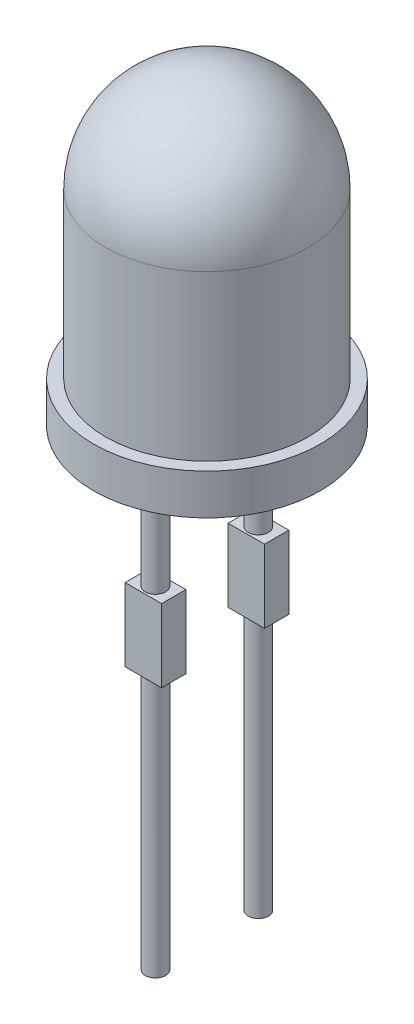
ISO-10303-21;
HEADER;
FILE_DESCRIPTION(('STEP AP214'),'2;1');
FILE_NAME('part.step','',(''),(''),'','','');
FILE_SCHEMA(('AUTOMOTIVE_DESIGN { 1 0 10303 214 1 1 1 1 }'));
ENDSEC;
DATA;
#1=APPLICATION_CONTEXT('core data for automotive mechanical design processes');
#2=APPLICATION_PROTOCOL_DEFINITION('international standard','automotive_design',2000,#1);
#3=PRODUCT_CONTEXT('',#1,'mechanical');
#4=PRODUCT('Part','Part','',(#3));
#5=PRODUCT_RELATED_PRODUCT_CATEGORY('part','',(#4));
#6=PRODUCT_DEFINITION_FORMATION('','',#4);
#7=PRODUCT_DEFINITION_CONTEXT('part definition',#1,'design');
#8=PRODUCT_DEFINITION('design','',#6,#7);
#9=PRODUCT_DEFINITION_SHAPE('','',#8);
#10=(LENGTH_UNIT() NAMED_UNIT(*) SI_UNIT(.MILLI.,.METRE.));
#11=(NAMED_UNIT(*) PLANE_ANGLE_UNIT() SI_UNIT($,.RADIAN.));
#12=(NAMED_UNIT(*) SI_UNIT($,.STERADIAN.) SOLID_ANGLE_UNIT());
#13=UNCERTAINTY_MEASURE_WITH_UNIT(LENGTH_MEASURE(1.E-05),#10,'distance_accuracy_value','');
#14=(GEOMETRIC_REPRESENTATION_CONTEXT(3) GLOBAL_UNCERTAINTY_ASSIGNED_CONTEXT((#13)) GLOBAL_UNIT_ASSIGNED_CONTEXT((#10,
#11,#12)) REPRESENTATION_CONTEXT('',''));
#15=CARTESIAN_POINT('',(0.,0.,0.));
#16=DIRECTION('',(0.,0.,1.));
#17=DIRECTION('',(1.,0.,0.));
#18=AXIS2_PLACEMENT_3D('',#15,#16,#17);
#19=CARTESIAN_POINT('',(0.,-14.025,-1.27));
#20=DIRECTION('',(0.,1.,0.));
#21=DIRECTION('',(0.,0.,1.));
#22=AXIS2_PLACEMENT_3D('',#19,#20,#21);
#23=CYLINDRICAL_SURFACE('',#22,0.25);
#24=CARTESIAN_POINT('',(0.,-3.025,-1.27));
#25=DIRECTION('',(0.,-1.,0.));
#26=DIRECTION('',(0.,0.,1.));
#27=AXIS2_PLACEMENT_3D('',#24,#25,#26);
#28=CIRCLE('',#27,0.25);
#29=CARTESIAN_POINT('',(0.,-3.025,-1.02));
#30=VERTEX_POINT('',#29);
#31=EDGE_CURVE('E128',#30,#30,#28,.T.);
#32=ORIENTED_EDGE('',*,*,#31,.T.);
#33=EDGE_LOOP('',(#32));
#34=FACE_BOUND('',#33,.T.);
#35=CARTESIAN_POINT('',(0.,-5.825,-1.27));
#36=DIRECTION('',(0.,-1.,0.));
#37=DIRECTION('',(0.,0.,-1.));
#38=AXIS2_PLACEMENT_3D('',#35,#36,#37);
#39=CIRCLE('',#38,0.25);
#40=CARTESIAN_POINT('',(0.,-5.825,-1.52));
#41=VERTEX_POINT('',#40);
#42=EDGE_CURVE('E12',#41,#41,#39,.T.);
#43=ORIENTED_EDGE('',*,*,#42,.F.);
#44=EDGE_LOOP('',(#43));
#45=FACE_BOUND('',#44,.T.);
#46=ADVANCED_FACE('F50',(#34,#45),#23,.T.);
#47=CARTESIAN_POINT('',(0.,-3.025,-1.27));
#48=DIRECTION('',(0.,1.,0.));
#49=DIRECTION('',(0.,0.,1.));
#50=AXIS2_PLACEMENT_3D('',#47,#48,#49);
#51=PLANE('',#50);
#52=ORIENTED_EDGE('',*,*,#31,.F.);
#53=EDGE_LOOP('',(#52));
#54=FACE_BOUND('',#53,.T.);
#55=ADVANCED_FACE('F149',(#54),#51,.T.);
#56=CARTESIAN_POINT('',(0.45,-5.825,-1.57));
#57=DIRECTION('',(0.,0.,1.));
#58=DIRECTION('',(0.,-1.,0.));
#59=AXIS2_PLACEMENT_3D('',#56,#57,#58);
#60=PLANE('',#59);
#61=DIRECTION('',(0.,1.,0.));
#62=VECTOR('',#61,1.);
#63=CARTESIAN_POINT('',(-0.45,-5.825,-1.57));
#64=LINE('',#63,#62);
#65=CARTESIAN_POINT('',(-0.45,-7.625,-1.57));
#66=VERTEX_POINT('',#65);
#67=CARTESIAN_POINT('',(-0.45,-5.825,-1.57));
#68=VERTEX_POINT('',#67);
#69=EDGE_CURVE('E118',#66,#68,#64,.T.);
#70=ORIENTED_EDGE('',*,*,#69,.T.);
#71=DIRECTION('',(-1.,0.,0.));
#72=VECTOR('',#71,1.);
#73=CARTESIAN_POINT('',(0.45,-5.825,-1.57));
#74=LINE('',#73,#72);
#75=CARTESIAN_POINT('',(0.45,-5.825,-1.57));
#76=VERTEX_POINT('',#75);
#77=EDGE_CURVE('E109',#76,#68,#74,.T.);
#78=ORIENTED_EDGE('',*,*,#77,.F.);
#79=DIRECTION('',(0.,1.,0.));
#80=VECTOR('',#79,1.);
#81=CARTESIAN_POINT('',(0.45,-5.825,-1.57));
#82=LINE('',#81,#80);
#83=CARTESIAN_POINT('',(0.45,-7.625,-1.57));
#84=VERTEX_POINT('',#83);
#85=EDGE_CURVE('E103',#84,#76,#82,.T.);
#86=ORIENTED_EDGE('',*,*,#85,.F.);
#87=DIRECTION('',(-1.,0.,0.));
#88=VECTOR('',#87,1.);
#89=CARTESIAN_POINT('',(0.45,-7.625,-1.57));
#90=LINE('',#89,#88);
#91=EDGE_CURVE('E114',#84,#66,#90,.T.);
#92=ORIENTED_EDGE('',*,*,#91,.T.);
#93=EDGE_LOOP('',(#70,#78,#86,#92));
#94=FACE_BOUND('',#93,.T.);
#95=ADVANCED_FACE('F154',(#94),#60,.F.);
#96=CARTESIAN_POINT('',(0.45,-5.825,-0.970000000000001));
#97=DIRECTION('',(0.,-1.,0.));
#98=DIRECTION('',(0.,0.,-1.));
#99=AXIS2_PLACEMENT_3D('',#96,#97,#98);
#100=PLANE('',#99);
#101=ORIENTED_EDGE('',*,*,#42,.T.);
#102=EDGE_LOOP('',(#101));
#103=FACE_BOUND('',#102,.T.);
#104=DIRECTION('',(0.,0.,1.));
#105=VECTOR('',#104,1.);
#106=CARTESIAN_POINT('',(-0.45,-5.825,-0.970000000000001));
#107=LINE('',#106,#105);
#108=CARTESIAN_POINT('',(-0.45,-5.825,-0.970000000000001));
#109=VERTEX_POINT('',#108);
#110=EDGE_CURVE('E108',#68,#109,#107,.T.);
#111=ORIENTED_EDGE('',*,*,#110,.T.);
#112=DIRECTION('',(-1.,0.,0.));
#113=VECTOR('',#112,1.);
#114=CARTESIAN_POINT('',(0.45,-5.825,-0.970000000000001));
#115=LINE('',#114,#113);
#116=CARTESIAN_POINT('',(0.45,-5.825,-0.970000000000001));
#117=VERTEX_POINT('',#116);
#118=EDGE_CURVE('E106',#117,#109,#115,.T.);
#119=ORIENTED_EDGE('',*,*,#118,.F.);
#120=DIRECTION('',(0.,0.,1.));
#121=VECTOR('',#120,1.);
#122=CARTESIAN_POINT('',(0.45,-5.825,-0.970000000000001));
#123=LINE('',#122,#121);
#124=EDGE_CURVE('E98',#76,#117,#123,.T.);
#125=ORIENTED_EDGE('',*,*,#124,.F.);
#126=ORIENTED_EDGE('',*,*,#77,.T.);
#127=EDGE_LOOP('',(#111,#119,#125,#126));
#128=FACE_BOUND('',#127,.T.);
#129=ADVANCED_FACE('F107',(#103,#128),#100,.F.);
#130=CARTESIAN_POINT('',(0.45,-5.825,-0.970000000000001));
#131=DIRECTION('',(0.,0.,-1.));
#132=DIRECTION('',(0.,1.,0.));
#133=AXIS2_PLACEMENT_3D('',#130,#131,#132);
#134=PLANE('',#133);
#135=DIRECTION('',(0.,-1.,0.));
#136=VECTOR('',#135,1.);
#137=CARTESIAN_POINT('',(-0.45,-5.825,-0.970000000000001));
#138=LINE('',#137,#136);
#139=CARTESIAN_POINT('',(-0.45,-7.625,-0.970000000000001));
#140=VERTEX_POINT('',#139);
#141=EDGE_CURVE('E84',#109,#140,#138,.T.);
#142=ORIENTED_EDGE('',*,*,#141,.T.);
#143=DIRECTION('',(-1.,0.,0.));
#144=VECTOR('',#143,1.);
#145=CARTESIAN_POINT('',(0.45,-7.625,-0.970000000000001));
#146=LINE('',#145,#144);
#147=CARTESIAN_POINT('',(0.45,-7.625,-0.970000000000001));
#148=VERTEX_POINT('',#147);
#149=EDGE_CURVE('E110',#148,#140,#146,.T.);
#150=ORIENTED_EDGE('',*,*,#149,.F.);
#151=DIRECTION('',(0.,-1.,0.));
#152=VECTOR('',#151,1.);
#153=CARTESIAN_POINT('',(0.45,-5.825,-0.970000000000001));
#154=LINE('',#153,#152);
#155=EDGE_CURVE('E101',#117,#148,#154,.T.);
#156=ORIENTED_EDGE('',*,*,#155,.F.);
#157=ORIENTED_EDGE('',*,*,#118,.T.);
#158=EDGE_LOOP('',(#142,#150,#156,#157));
#159=FACE_BOUND('',#158,.T.);
#160=ADVANCED_FACE('F112',(#159),#134,.F.);
#161=CARTESIAN_POINT('',(0.45,-7.625,-0.970000000000001));
#162=DIRECTION('',(0.,1.,0.));
#163=DIRECTION('',(0.,0.,1.));
#164=AXIS2_PLACEMENT_3D('',#161,#162,#163);
#165=PLANE('',#164);
#166=CARTESIAN_POINT('',(0.,-7.625,-1.27));
#167=DIRECTION('',(0.,1.,0.));
#168=DIRECTION('',(0.,0.,1.));
#169=AXIS2_PLACEMENT_3D('',#166,#167,#168);
#170=CIRCLE('',#169,0.25);
#171=CARTESIAN_POINT('',(0.,-7.625,-1.02));
#172=VERTEX_POINT('',#171);
#173=EDGE_CURVE('E59',#172,#172,#170,.T.);
#174=ORIENTED_EDGE('',*,*,#173,.T.);
#175=EDGE_LOOP('',(#174));
#176=FACE_BOUND('',#175,.T.);
#177=DIRECTION('',(0.,0.,-1.));
#178=VECTOR('',#177,1.);
#179=CARTESIAN_POINT('',(-0.45,-7.625,-0.970000000000001));
#180=LINE('',#179,#178);
#181=EDGE_CURVE('E90',#140,#66,#180,.T.);
#182=ORIENTED_EDGE('',*,*,#181,.T.);
#183=ORIENTED_EDGE('',*,*,#91,.F.);
#184=DIRECTION('',(0.,0.,-1.));
#185=VECTOR('',#184,1.);
#186=CARTESIAN_POINT('',(0.45,-7.625,-0.970000000000001));
#187=LINE('',#186,#185);
#188=EDGE_CURVE('E67',#148,#84,#187,.T.);
#189=ORIENTED_EDGE('',*,*,#188,.F.);
#190=ORIENTED_EDGE('',*,*,#149,.T.);
#191=EDGE_LOOP('',(#182,#183,#189,#190));
#192=FACE_BOUND('',#191,.T.);
#193=ADVANCED_FACE('F135',(#176,#192),#165,.F.);
#194=CARTESIAN_POINT('',(0.45,0.,0.));
#195=DIRECTION('',(1.,0.,0.));
#196=DIRECTION('',(0.,0.,-1.));
#197=AXIS2_PLACEMENT_3D('',#194,#195,#196);
#198=PLANE('',#197);
#199=ORIENTED_EDGE('',*,*,#85,.T.);
#200=ORIENTED_EDGE('',*,*,#124,.T.);
#201=ORIENTED_EDGE('',*,*,#155,.T.);
#202=ORIENTED_EDGE('',*,*,#188,.T.);
#203=EDGE_LOOP('',(#199,#200,#201,#202));
#204=FACE_BOUND('',#203,.T.);
#205=ADVANCED_FACE('F99',(#204),#198,.T.);
#206=CARTESIAN_POINT('',(-0.45,0.,0.));
#207=DIRECTION('',(1.,0.,0.));
#208=DIRECTION('',(0.,0.,-1.));
#209=AXIS2_PLACEMENT_3D('',#206,#207,#208);
#210=PLANE('',#209);
#211=ORIENTED_EDGE('',*,*,#69,.F.);
#212=ORIENTED_EDGE('',*,*,#181,.F.);
#213=ORIENTED_EDGE('',*,*,#141,.F.);
#214=ORIENTED_EDGE('',*,*,#110,.F.);
#215=EDGE_LOOP('',(#211,#212,#213,#214));
#216=FACE_BOUND('',#215,.T.);
#217=ADVANCED_FACE('F144',(#216),#210,.F.);
#218=CARTESIAN_POINT('',(0.,-14.025,-1.27));
#219=DIRECTION('',(0.,1.,0.));
#220=DIRECTION('',(0.,0.,1.));
#221=AXIS2_PLACEMENT_3D('',#218,#219,#220);
#222=PLANE('',#221);
#223=CARTESIAN_POINT('',(0.,-14.025,-1.27));
#224=DIRECTION('',(0.,-1.,0.));
#225=DIRECTION('',(0.,0.,1.));
#226=AXIS2_PLACEMENT_3D('',#223,#224,#225);
#227=CIRCLE('',#226,0.25);
#228=CARTESIAN_POINT('',(0.,-14.025,-1.02));
#229=VERTEX_POINT('',#228);
#230=EDGE_CURVE('E127',#229,#229,#227,.T.);
#231=ORIENTED_EDGE('',*,*,#230,.T.);
#232=EDGE_LOOP('',(#231));
#233=FACE_BOUND('',#232,.T.);
#234=ADVANCED_FACE('F52',(#233),#222,.F.);
#235=ORIENTED_EDGE('',*,*,#230,.F.);
#236=EDGE_LOOP('',(#235));
#237=FACE_BOUND('',#236,.T.);
#238=ORIENTED_EDGE('',*,*,#173,.F.);
#239=EDGE_LOOP('',(#238));
#240=FACE_BOUND('',#239,.T.);
#241=ADVANCED_FACE('F137',(#237,#240),#23,.T.);
#242=CLOSED_SHELL('',(#46,#55,#95,#129,#160,#193,#205,#217,#234,#241));
#243=MANIFOLD_SOLID_BREP('B2',#242);
#244=CARTESIAN_POINT('',(0.,-14.025,1.27));
#245=DIRECTION('',(0.,1.,0.));
#246=DIRECTION('',(0.,0.,1.));
#247=AXIS2_PLACEMENT_3D('',#244,#245,#246);
#248=CYLINDRICAL_SURFACE('',#247,0.25);
#249=CARTESIAN_POINT('',(0.,-3.025,1.27));
#250=DIRECTION('',(0.,-1.,0.));
#251=DIRECTION('',(0.,0.,-1.));
#252=AXIS2_PLACEMENT_3D('',#249,#250,#251);
#253=CIRCLE('',#252,0.25);
#254=CARTESIAN_POINT('',(0.,-3.025,1.02));
#255=VERTEX_POINT('',#254);
#256=EDGE_CURVE('E329',#255,#255,#253,.T.);
#257=ORIENTED_EDGE('',*,*,#256,.T.);
#258=EDGE_LOOP('',(#257));
#259=FACE_BOUND('',#258,.T.);
#260=CARTESIAN_POINT('',(0.,-5.825,1.27));
#261=DIRECTION('',(0.,-1.,0.));
#262=DIRECTION('',(0.,0.,-1.));
#263=AXIS2_PLACEMENT_3D('',#260,#261,#262);
#264=CIRCLE('',#263,0.25);
#265=CARTESIAN_POINT('',(0.,-5.825,1.02));
#266=VERTEX_POINT('',#265);
#267=EDGE_CURVE('E48',#266,#266,#264,.T.);
#268=ORIENTED_EDGE('',*,*,#267,.F.);
#269=EDGE_LOOP('',(#268));
#270=FACE_BOUND('',#269,.T.);
#271=ADVANCED_FACE('F260',(#259,#270),#248,.T.);
#272=CARTESIAN_POINT('',(0.,-3.025,1.27));
#273=DIRECTION('',(0.,-1.,0.));
#274=DIRECTION('',(0.,0.,-1.));
#275=AXIS2_PLACEMENT_3D('',#272,#273,#274);
#276=PLANE('',#275);
#277=ORIENTED_EDGE('',*,*,#256,.F.);
#278=EDGE_LOOP('',(#277));
#279=FACE_BOUND('',#278,.T.);
#280=ADVANCED_FACE('F353',(#279),#276,.F.);
#281=CARTESIAN_POINT('',(0.45,-5.825,0.970000000000001));
#282=DIRECTION('',(0.,0.,1.));
#283=DIRECTION('',(0.,-1.,0.));
#284=AXIS2_PLACEMENT_3D('',#281,#282,#283);
#285=PLANE('',#284);
#286=DIRECTION('',(0.,1.,0.));
#287=VECTOR('',#286,1.);
#288=CARTESIAN_POINT('',(-0.45,-5.825,0.970000000000001));
#289=LINE('',#288,#287);
#290=CARTESIAN_POINT('',(-0.45,-7.625,0.970000000000001));
#291=VERTEX_POINT('',#290);
#292=CARTESIAN_POINT('',(-0.45,-5.825,0.970000000000001));
#293=VERTEX_POINT('',#292);
#294=EDGE_CURVE('E321',#291,#293,#289,.T.);
#295=ORIENTED_EDGE('',*,*,#294,.T.);
#296=DIRECTION('',(-1.,0.,0.));
#297=VECTOR('',#296,1.);
#298=CARTESIAN_POINT('',(0.45,-5.825,0.970000000000001));
#299=LINE('',#298,#297);
#300=CARTESIAN_POINT('',(0.45,-5.825,0.970000000000001));
#301=VERTEX_POINT('',#300);
#302=EDGE_CURVE('E368',#301,#293,#299,.T.);
#303=ORIENTED_EDGE('',*,*,#302,.F.);
#304=DIRECTION('',(0.,1.,0.));
#305=VECTOR('',#304,1.);
#306=CARTESIAN_POINT('',(0.45,-5.825,0.970000000000001));
#307=LINE('',#306,#305);
#308=CARTESIAN_POINT('',(0.45,-7.625,0.970000000000001));
#309=VERTEX_POINT('',#308);
#310=EDGE_CURVE('E322',#309,#301,#307,.T.);
#311=ORIENTED_EDGE('',*,*,#310,.F.);
#312=DIRECTION('',(-1.,0.,0.));
#313=VECTOR('',#312,1.);
#314=CARTESIAN_POINT('',(0.45,-7.625,0.970000000000001));
#315=LINE('',#314,#313);
#316=EDGE_CURVE('E317',#309,#291,#315,.T.);
#317=ORIENTED_EDGE('',*,*,#316,.T.);
#318=EDGE_LOOP('',(#295,#303,#311,#317));
#319=FACE_BOUND('',#318,.T.);
#320=ADVANCED_FACE('F358',(#319),#285,.F.);
#321=CARTESIAN_POINT('',(0.45,-5.825,0.970000000000001));
#322=DIRECTION('',(0.,-1.,0.));
#323=DIRECTION('',(0.,0.,-1.));
#324=AXIS2_PLACEMENT_3D('',#321,#322,#323);
#325=PLANE('',#324);
#326=ORIENTED_EDGE('',*,*,#267,.T.);
#327=EDGE_LOOP('',(#326));
#328=FACE_BOUND('',#327,.T.);
#329=DIRECTION('',(0.,0.,1.));
#330=VECTOR('',#329,1.);
#331=CARTESIAN_POINT('',(-0.45,-5.825,0.970000000000001));
#332=LINE('',#331,#330);
#333=CARTESIAN_POINT('',(-0.45,-5.825,1.57));
#334=VERTEX_POINT('',#333);
#335=EDGE_CURVE('E276',#293,#334,#332,.T.);
#336=ORIENTED_EDGE('',*,*,#335,.T.);
#337=DIRECTION('',(-1.,0.,0.));
#338=VECTOR('',#337,1.);
#339=CARTESIAN_POINT('',(0.45,-5.825,1.57));
#340=LINE('',#339,#338);
#341=CARTESIAN_POINT('',(0.45,-5.825,1.57));
#342=VERTEX_POINT('',#341);
#343=EDGE_CURVE('E313',#342,#334,#340,.T.);
#344=ORIENTED_EDGE('',*,*,#343,.F.);
#345=DIRECTION('',(0.,0.,1.));
#346=VECTOR('',#345,1.);
#347=CARTESIAN_POINT('',(0.45,-5.825,0.970000000000001));
#348=LINE('',#347,#346);
#349=EDGE_CURVE('E292',#301,#342,#348,.T.);
#350=ORIENTED_EDGE('',*,*,#349,.F.);
#351=ORIENTED_EDGE('',*,*,#302,.T.);
#352=EDGE_LOOP('',(#336,#344,#350,#351));
#353=FACE_BOUND('',#352,.T.);
#354=ADVANCED_FACE('F364',(#328,#353),#325,.F.);
#355=CARTESIAN_POINT('',(0.45,-5.825,1.57));
#356=DIRECTION('',(0.,0.,-1.));
#357=DIRECTION('',(0.,1.,0.));
#358=AXIS2_PLACEMENT_3D('',#355,#356,#357);
#359=PLANE('',#358);
#360=DIRECTION('',(0.,-1.,0.));
#361=VECTOR('',#360,1.);
#362=CARTESIAN_POINT('',(-0.45,-5.825,1.57));
#363=LINE('',#362,#361);
#364=CARTESIAN_POINT('',(-0.45,-7.625,1.57));
#365=VERTEX_POINT('',#364);
#366=EDGE_CURVE('E308',#334,#365,#363,.T.);
#367=ORIENTED_EDGE('',*,*,#366,.T.);
#368=DIRECTION('',(-1.,0.,0.));
#369=VECTOR('',#368,1.);
#370=CARTESIAN_POINT('',(0.45,-7.625,1.57));
#371=LINE('',#370,#369);
#372=CARTESIAN_POINT('',(0.45,-7.625,1.57));
#373=VERTEX_POINT('',#372);
#374=EDGE_CURVE('E311',#373,#365,#371,.T.);
#375=ORIENTED_EDGE('',*,*,#374,.F.);
#376=DIRECTION('',(0.,-1.,0.));
#377=VECTOR('',#376,1.);
#378=CARTESIAN_POINT('',(0.45,-5.825,1.57));
#379=LINE('',#378,#377);
#380=EDGE_CURVE('E331',#342,#373,#379,.T.);
#381=ORIENTED_EDGE('',*,*,#380,.F.);
#382=ORIENTED_EDGE('',*,*,#343,.T.);
#383=EDGE_LOOP('',(#367,#375,#381,#382));
#384=FACE_BOUND('',#383,.T.);
#385=ADVANCED_FACE('F309',(#384),#359,.F.);
#386=CARTESIAN_POINT('',(0.45,-7.625,0.970000000000001));
#387=DIRECTION('',(0.,1.,0.));
#388=DIRECTION('',(0.,0.,1.));
#389=AXIS2_PLACEMENT_3D('',#386,#387,#388);
#390=PLANE('',#389);
#391=CARTESIAN_POINT('',(0.,-7.625,1.27));
#392=DIRECTION('',(0.,1.,0.));
#393=DIRECTION('',(0.,0.,1.));
#394=AXIS2_PLACEMENT_3D('',#391,#392,#393);
#395=CIRCLE('',#394,0.25);
#396=CARTESIAN_POINT('',(0.,-7.625,1.52));
#397=VERTEX_POINT('',#396);
#398=EDGE_CURVE('E268',#397,#397,#395,.T.);
#399=ORIENTED_EDGE('',*,*,#398,.T.);
#400=EDGE_LOOP('',(#399));
#401=FACE_BOUND('',#400,.T.);
#402=DIRECTION('',(0.,0.,-1.));
#403=VECTOR('',#402,1.);
#404=CARTESIAN_POINT('',(-0.45,-7.625,0.970000000000001));
#405=LINE('',#404,#403);
#406=EDGE_CURVE('E302',#365,#291,#405,.T.);
#407=ORIENTED_EDGE('',*,*,#406,.T.);
#408=ORIENTED_EDGE('',*,*,#316,.F.);
#409=DIRECTION('',(0.,0.,-1.));
#410=VECTOR('',#409,1.);
#411=CARTESIAN_POINT('',(0.45,-7.625,0.970000000000001));
#412=LINE('',#411,#410);
#413=EDGE_CURVE('E316',#373,#309,#412,.T.);
#414=ORIENTED_EDGE('',*,*,#413,.F.);
#415=ORIENTED_EDGE('',*,*,#374,.T.);
#416=EDGE_LOOP('',(#407,#408,#414,#415));
#417=FACE_BOUND('',#416,.T.);
#418=ADVANCED_FACE('F315',(#401,#417),#390,.F.);
#419=CARTESIAN_POINT('',(0.45,0.,0.));
#420=DIRECTION('',(-1.,0.,0.));
#421=DIRECTION('',(0.,0.,1.));
#422=AXIS2_PLACEMENT_3D('',#419,#420,#421);
#423=PLANE('',#422);
#424=ORIENTED_EDGE('',*,*,#310,.T.);
#425=ORIENTED_EDGE('',*,*,#349,.T.);
#426=ORIENTED_EDGE('',*,*,#380,.T.);
#427=ORIENTED_EDGE('',*,*,#413,.T.);
#428=EDGE_LOOP('',(#424,#425,#426,#427));
#429=FACE_BOUND('',#428,.T.);
#430=ADVANCED_FACE('F372',(#429),#423,.F.);
#431=CARTESIAN_POINT('',(-0.45,0.,0.));
#432=DIRECTION('',(-1.,0.,0.));
#433=DIRECTION('',(0.,0.,1.));
#434=AXIS2_PLACEMENT_3D('',#431,#432,#433);
#435=PLANE('',#434);
#436=ORIENTED_EDGE('',*,*,#294,.F.);
#437=ORIENTED_EDGE('',*,*,#406,.F.);
#438=ORIENTED_EDGE('',*,*,#366,.F.);
#439=ORIENTED_EDGE('',*,*,#335,.F.);
#440=EDGE_LOOP('',(#436,#437,#438,#439));
#441=FACE_BOUND('',#440,.T.);
#442=ADVANCED_FACE('F319',(#441),#435,.T.);
#443=CARTESIAN_POINT('',(0.,-14.025,1.27));
#444=DIRECTION('',(0.,-1.,0.));
#445=DIRECTION('',(0.,0.,-1.));
#446=AXIS2_PLACEMENT_3D('',#443,#444,#445);
#447=PLANE('',#446);
#448=CARTESIAN_POINT('',(0.,-14.025,1.27));
#449=DIRECTION('',(0.,-1.,0.));
#450=DIRECTION('',(0.,0.,-1.));
#451=AXIS2_PLACEMENT_3D('',#448,#449,#450);
#452=CIRCLE('',#451,0.25);
#453=CARTESIAN_POINT('',(0.,-14.025,1.02));
#454=VERTEX_POINT('',#453);
#455=EDGE_CURVE('E334',#454,#454,#452,.T.);
#456=ORIENTED_EDGE('',*,*,#455,.T.);
#457=EDGE_LOOP('',(#456));
#458=FACE_BOUND('',#457,.T.);
#459=ADVANCED_FACE('F344',(#458),#447,.T.);
#460=ORIENTED_EDGE('',*,*,#455,.F.);
#461=EDGE_LOOP('',(#460));
#462=FACE_BOUND('',#461,.T.);
#463=ORIENTED_EDGE('',*,*,#398,.F.);
#464=EDGE_LOOP('',(#463));
#465=FACE_BOUND('',#464,.T.);
#466=ADVANCED_FACE('F342',(#462,#465),#248,.T.);
#467=CLOSED_SHELL('',(#271,#280,#320,#354,#385,#418,#430,#442,#459,#466));
#468=MANIFOLD_SOLID_BREP('B6',#467);
#469=CARTESIAN_POINT('',(0.,2.025,0.));
#470=DIRECTION('',(0.,1.,0.));
#471=DIRECTION('',(0.,0.,1.));
#472=AXIS2_PLACEMENT_3D('',#469,#470,#471);
#473=SPHERICAL_SURFACE('',#472,2.5);
#474=CARTESIAN_POINT('',(0.,2.025,0.));
#475=DIRECTION('',(0.,1.,0.));
#476=DIRECTION('',(0.,0.,1.));
#477=AXIS2_PLACEMENT_3D('',#474,#475,#476);
#478=CIRCLE('',#477,2.5);
#479=CARTESIAN_POINT('',(0.,2.025,2.5));
#480=VERTEX_POINT('',#479);
#481=EDGE_CURVE('E477',#480,#480,#478,.T.);
#482=ORIENTED_EDGE('',*,*,#481,.T.);
#483=EDGE_LOOP('',(#482));
#484=FACE_BOUND('',#483,.T.);
#485=ADVANCED_FACE('F463',(#484),#473,.T.);
#486=CARTESIAN_POINT('',(0.,-3.025,2.8));
#487=DIRECTION('',(0.,-1.,0.));
#488=DIRECTION('',(0.,0.,-1.));
#489=AXIS2_PLACEMENT_3D('',#486,#487,#488);
#490=PLANE('',#489);
#491=CARTESIAN_POINT('',(0.,-3.025,0.));
#492=DIRECTION('',(0.,1.,0.));
#493=DIRECTION('',(0.,0.,1.));
#494=AXIS2_PLACEMENT_3D('',#491,#492,#493);
#495=CIRCLE('',#494,2.8);
#496=CARTESIAN_POINT('',(0.,-3.025,2.8));
#497=VERTEX_POINT('',#496);
#498=EDGE_CURVE('E259',#497,#497,#495,.T.);
#499=ORIENTED_EDGE('',*,*,#498,.F.);
#500=EDGE_LOOP('',(#499));
#501=FACE_BOUND('',#500,.T.);
#502=ADVANCED_FACE('F495',(#501),#490,.T.);
#503=CARTESIAN_POINT('',(0.,4.525,0.));
#504=DIRECTION('',(0.,1.,0.));
#505=DIRECTION('',(0.,0.,1.));
#506=AXIS2_PLACEMENT_3D('',#503,#504,#505);
#507=CYLINDRICAL_SURFACE('',#506,2.8);
#508=ORIENTED_EDGE('',*,*,#498,.T.);
#509=EDGE_LOOP('',(#508));
#510=FACE_BOUND('',#509,.T.);
#511=CARTESIAN_POINT('',(0.,-2.025,0.));
#512=DIRECTION('',(0.,1.,0.));
#513=DIRECTION('',(0.,0.,1.));
#514=AXIS2_PLACEMENT_3D('',#511,#512,#513);
#515=CIRCLE('',#514,2.8);
#516=CARTESIAN_POINT('',(0.,-2.025,2.8));
#517=VERTEX_POINT('',#516);
#518=EDGE_CURVE('E469',#517,#517,#515,.T.);
#519=ORIENTED_EDGE('',*,*,#518,.F.);
#520=EDGE_LOOP('',(#519));
#521=FACE_BOUND('',#520,.T.);
#522=ADVANCED_FACE('F492',(#510,#521),#507,.T.);
#523=CARTESIAN_POINT('',(0.,-2.025,2.5));
#524=DIRECTION('',(0.,1.,0.));
#525=DIRECTION('',(0.,0.,1.));
#526=AXIS2_PLACEMENT_3D('',#523,#524,#525);
#527=PLANE('',#526);
#528=ORIENTED_EDGE('',*,*,#518,.T.);
#529=EDGE_LOOP('',(#528));
#530=FACE_BOUND('',#529,.T.);
#531=CARTESIAN_POINT('',(0.,-2.025,0.));
#532=DIRECTION('',(0.,1.,0.));
#533=DIRECTION('',(0.,0.,1.));
#534=AXIS2_PLACEMENT_3D('',#531,#532,#533);
#535=CIRCLE('',#534,2.5);
#536=CARTESIAN_POINT('',(0.,-2.025,2.5));
#537=VERTEX_POINT('',#536);
#538=EDGE_CURVE('E473',#537,#537,#535,.T.);
#539=ORIENTED_EDGE('',*,*,#538,.F.);
#540=EDGE_LOOP('',(#539));
#541=FACE_BOUND('',#540,.T.);
#542=ADVANCED_FACE('F486',(#530,#541),#527,.T.);
#543=CARTESIAN_POINT('',(0.,4.525,0.));
#544=DIRECTION('',(0.,1.,0.));
#545=DIRECTION('',(0.,0.,1.));
#546=AXIS2_PLACEMENT_3D('',#543,#544,#545);
#547=CYLINDRICAL_SURFACE('',#546,2.5);
#548=ORIENTED_EDGE('',*,*,#538,.T.);
#549=EDGE_LOOP('',(#548));
#550=FACE_BOUND('',#549,.T.);
#551=ORIENTED_EDGE('',*,*,#481,.F.);
#552=EDGE_LOOP('',(#551));
#553=FACE_BOUND('',#552,.T.);
#554=ADVANCED_FACE('F484',(#550,#553),#547,.T.);
#555=CLOSED_SHELL('',(#485,#502,#522,#542,#554));
#556=MANIFOLD_SOLID_BREP('B42',#555);
#557=ADVANCED_BREP_SHAPE_REPRESENTATION('',(#18,#243,#468,#556),#14);
#558=SHAPE_DEFINITION_REPRESENTATION(#9,#557);
ENDSEC;
END-ISO-10303-21;
